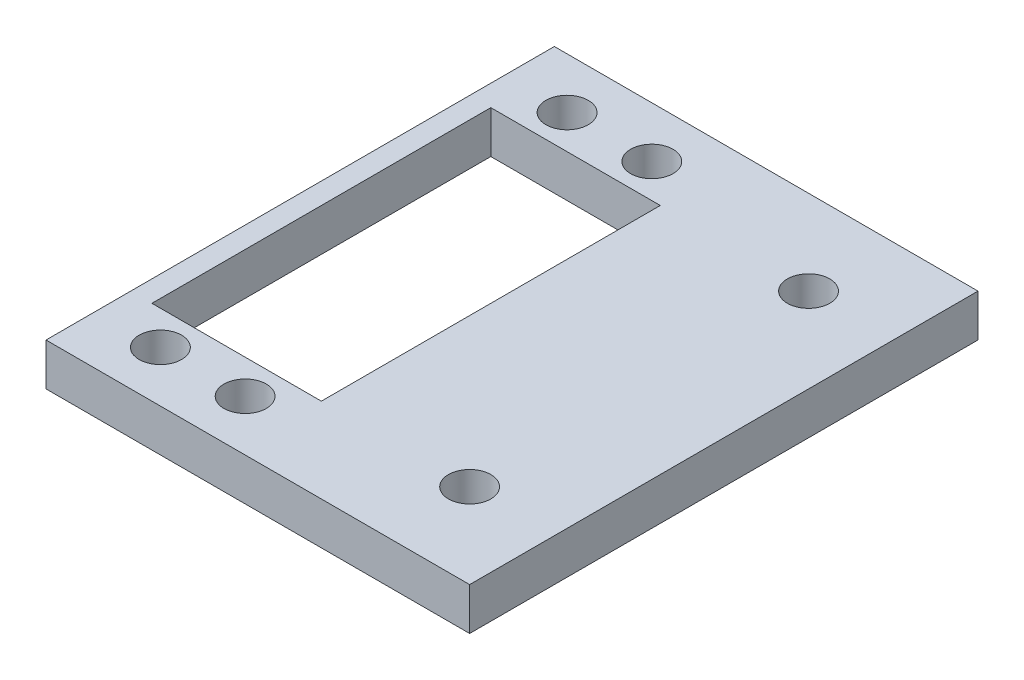
ISO-10303-21;
HEADER;
FILE_DESCRIPTION(('STEP AP214'),'2;1');
FILE_NAME('part.step','',(''),(''),'','','');
FILE_SCHEMA(('AUTOMOTIVE_DESIGN { 1 0 10303 214 1 1 1 1 }'));
ENDSEC;
DATA;
#1=APPLICATION_CONTEXT('core data for automotive mechanical design processes');
#2=APPLICATION_PROTOCOL_DEFINITION('international standard','automotive_design',2000,#1);
#3=PRODUCT_CONTEXT('',#1,'mechanical');
#4=PRODUCT('Part','Part','',(#3));
#5=PRODUCT_RELATED_PRODUCT_CATEGORY('part','',(#4));
#6=PRODUCT_DEFINITION_FORMATION('','',#4);
#7=PRODUCT_DEFINITION_CONTEXT('part definition',#1,'design');
#8=PRODUCT_DEFINITION('design','',#6,#7);
#9=PRODUCT_DEFINITION_SHAPE('','',#8);
#10=(LENGTH_UNIT() NAMED_UNIT(*) SI_UNIT(.MILLI.,.METRE.));
#11=(NAMED_UNIT(*) PLANE_ANGLE_UNIT() SI_UNIT($,.RADIAN.));
#12=(NAMED_UNIT(*) SI_UNIT($,.STERADIAN.) SOLID_ANGLE_UNIT());
#13=UNCERTAINTY_MEASURE_WITH_UNIT(LENGTH_MEASURE(1.E-05),#10,'distance_accuracy_value','');
#14=(GEOMETRIC_REPRESENTATION_CONTEXT(3) GLOBAL_UNCERTAINTY_ASSIGNED_CONTEXT((#13)) GLOBAL_UNIT_ASSIGNED_CONTEXT((#10,
#11,#12)) REPRESENTATION_CONTEXT('',''));
#15=CARTESIAN_POINT('',(0.,0.,0.));
#16=DIRECTION('',(0.,0.,1.));
#17=DIRECTION('',(1.,0.,0.));
#18=AXIS2_PLACEMENT_3D('',#15,#16,#17);
#19=CARTESIAN_POINT('',(0.,5.,0.));
#20=DIRECTION('',(0.,1.,0.));
#21=DIRECTION('',(0.,0.,1.));
#22=AXIS2_PLACEMENT_3D('',#19,#20,#21);
#23=PLANE('',#22);
#24=CARTESIAN_POINT('',(-43.1194690265487,5.,12.0088495575223));
#25=DIRECTION('',(0.,1.,0.));
#26=DIRECTION('',(0.,0.,-1.));
#27=AXIS2_PLACEMENT_3D('',#24,#25,#26);
#28=CIRCLE('',#27,2.50000000000001);
#29=CARTESIAN_POINT('',(-43.1194690265487,5.,9.50884955752231));
#30=VERTEX_POINT('',#29);
#31=EDGE_CURVE('E273',#30,#30,#28,.T.);
#32=ORIENTED_EDGE('',*,*,#31,.F.);
#33=EDGE_LOOP('',(#32));
#34=FACE_BOUND('',#33,.T.);
#35=CARTESIAN_POINT('',(-43.1194690265487,5.,-35.9911504424781));
#36=DIRECTION('',(0.,1.,0.));
#37=DIRECTION('',(0.,0.,1.));
#38=AXIS2_PLACEMENT_3D('',#35,#36,#37);
#39=CIRCLE('',#38,2.5);
#40=CARTESIAN_POINT('',(-43.1194690265487,5.,-33.4911504424781));
#41=VERTEX_POINT('',#40);
#42=EDGE_CURVE('E127',#41,#41,#39,.T.);
#43=ORIENTED_EDGE('',*,*,#42,.F.);
#44=EDGE_LOOP('',(#43));
#45=FACE_BOUND('',#44,.T.);
#46=CARTESIAN_POINT('',(-10.6194690265487,5.,-31.9911504424779));
#47=DIRECTION('',(0.,1.,0.));
#48=DIRECTION('',(0.,0.,1.));
#49=AXIS2_PLACEMENT_3D('',#46,#47,#48);
#50=CIRCLE('',#49,2.5);
#51=CARTESIAN_POINT('',(-10.6194690265487,5.,-29.4911504424779));
#52=VERTEX_POINT('',#51);
#53=EDGE_CURVE('E143',#52,#52,#50,.T.);
#54=ORIENTED_EDGE('',*,*,#53,.F.);
#55=EDGE_LOOP('',(#54));
#56=FACE_BOUND('',#55,.T.);
#57=DIRECTION('',(0.,0.,1.));
#58=VECTOR('',#57,1.);
#59=CARTESIAN_POINT('',(-50.6194690265487,5.,-41.9911504424779));
#60=LINE('',#59,#58);
#61=CARTESIAN_POINT('',(-50.6194690265487,5.,-41.9911504424779));
#62=VERTEX_POINT('',#61);
#63=CARTESIAN_POINT('',(-50.6194690265487,5.,18.0088495575221));
#64=VERTEX_POINT('',#63);
#65=EDGE_CURVE('E149',#62,#64,#60,.T.);
#66=ORIENTED_EDGE('',*,*,#65,.T.);
#67=DIRECTION('',(1.,0.,0.));
#68=VECTOR('',#67,1.);
#69=CARTESIAN_POINT('',(-50.6194690265487,5.,18.0088495575221));
#70=LINE('',#69,#68);
#71=CARTESIAN_POINT('',(-0.619469026548708,5.,18.0088495575221));
#72=VERTEX_POINT('',#71);
#73=EDGE_CURVE('E152',#64,#72,#70,.T.);
#74=ORIENTED_EDGE('',*,*,#73,.T.);
#75=DIRECTION('',(0.,0.,-1.));
#76=VECTOR('',#75,1.);
#77=CARTESIAN_POINT('',(-0.61946902654872,5.,-41.9911504424779));
#78=LINE('',#77,#76);
#79=CARTESIAN_POINT('',(-0.61946902654872,5.,-41.9911504424779));
#80=VERTEX_POINT('',#79);
#81=EDGE_CURVE('E155',#72,#80,#78,.T.);
#82=ORIENTED_EDGE('',*,*,#81,.T.);
#83=DIRECTION('',(-1.,0.,0.));
#84=VECTOR('',#83,1.);
#85=CARTESIAN_POINT('',(-50.6194690265487,5.,-41.9911504424779));
#86=LINE('',#85,#84);
#87=EDGE_CURVE('E157',#80,#62,#86,.T.);
#88=ORIENTED_EDGE('',*,*,#87,.T.);
#89=EDGE_LOOP('',(#66,#74,#82,#88));
#90=FACE_BOUND('',#89,.T.);
#91=CARTESIAN_POINT('',(-10.6194690265487,5.,8.00884955752211));
#92=DIRECTION('',(0.,1.,0.));
#93=DIRECTION('',(0.,0.,-1.));
#94=AXIS2_PLACEMENT_3D('',#91,#92,#93);
#95=CIRCLE('',#94,2.5);
#96=CARTESIAN_POINT('',(-10.6194690265487,5.,5.50884955752211));
#97=VERTEX_POINT('',#96);
#98=EDGE_CURVE('E137',#97,#97,#95,.T.);
#99=ORIENTED_EDGE('',*,*,#98,.F.);
#100=EDGE_LOOP('',(#99));
#101=FACE_BOUND('',#100,.T.);
#102=DIRECTION('',(-1.,0.,0.));
#103=VECTOR('',#102,1.);
#104=CARTESIAN_POINT('',(-48.1194690265487,5.,-31.9911504424779));
#105=LINE('',#104,#103);
#106=CARTESIAN_POINT('',(-28.1194690265487,5.,-31.9911504424779));
#107=VERTEX_POINT('',#106);
#108=CARTESIAN_POINT('',(-48.1194690265487,5.,-31.9911504424779));
#109=VERTEX_POINT('',#108);
#110=EDGE_CURVE('E106',#107,#109,#105,.T.);
#111=ORIENTED_EDGE('',*,*,#110,.F.);
#112=DIRECTION('',(0.,0.,-1.));
#113=VECTOR('',#112,1.);
#114=CARTESIAN_POINT('',(-28.1194690265487,5.,-31.9911504424779));
#115=LINE('',#114,#113);
#116=CARTESIAN_POINT('',(-28.1194690265487,5.,8.0088495575221));
#117=VERTEX_POINT('',#116);
#118=EDGE_CURVE('E98',#117,#107,#115,.T.);
#119=ORIENTED_EDGE('',*,*,#118,.F.);
#120=DIRECTION('',(1.,0.,0.));
#121=VECTOR('',#120,1.);
#122=CARTESIAN_POINT('',(-48.1194690265487,5.,8.0088495575221));
#123=LINE('',#122,#121);
#124=CARTESIAN_POINT('',(-48.1194690265487,5.,8.0088495575221));
#125=VERTEX_POINT('',#124);
#126=EDGE_CURVE('E121',#125,#117,#123,.T.);
#127=ORIENTED_EDGE('',*,*,#126,.F.);
#128=DIRECTION('',(0.,0.,1.));
#129=VECTOR('',#128,1.);
#130=CARTESIAN_POINT('',(-48.1194690265487,5.,-31.9911504424779));
#131=LINE('',#130,#129);
#132=EDGE_CURVE('E119',#109,#125,#131,.T.);
#133=ORIENTED_EDGE('',*,*,#132,.F.);
#134=EDGE_LOOP('',(#111,#119,#127,#133));
#135=FACE_BOUND('',#134,.T.);
#136=CARTESIAN_POINT('',(-33.1194690265488,5.,-35.9911504424781));
#137=DIRECTION('',(0.,1.,0.));
#138=DIRECTION('',(0.,0.,1.));
#139=AXIS2_PLACEMENT_3D('',#136,#137,#138);
#140=CIRCLE('',#139,2.49999999999999);
#141=CARTESIAN_POINT('',(-33.1194690265488,5.,-33.4911504424781));
#142=VERTEX_POINT('',#141);
#143=EDGE_CURVE('E279',#142,#142,#140,.T.);
#144=ORIENTED_EDGE('',*,*,#143,.F.);
#145=EDGE_LOOP('',(#144));
#146=FACE_BOUND('',#145,.T.);
#147=CARTESIAN_POINT('',(-33.1194690265487,5.,12.0088495575223));
#148=DIRECTION('',(0.,1.,0.));
#149=DIRECTION('',(0.,0.,-1.));
#150=AXIS2_PLACEMENT_3D('',#147,#148,#149);
#151=CIRCLE('',#150,2.49999999999999);
#152=CARTESIAN_POINT('',(-33.1194690265487,5.,9.50884955752229));
#153=VERTEX_POINT('',#152);
#154=EDGE_CURVE('E264',#153,#153,#151,.T.);
#155=ORIENTED_EDGE('',*,*,#154,.F.);
#156=EDGE_LOOP('',(#155));
#157=FACE_BOUND('',#156,.T.);
#158=ADVANCED_FACE('F33',(#34,#45,#56,#90,#101,#135,#146,#157),#23,.T.);
#159=CARTESIAN_POINT('',(0.,0.,0.));
#160=DIRECTION('',(0.,1.,0.));
#161=DIRECTION('',(0.,0.,1.));
#162=AXIS2_PLACEMENT_3D('',#159,#160,#161);
#163=PLANE('',#162);
#164=CARTESIAN_POINT('',(-10.6194690265487,0.,8.00884955752211));
#165=DIRECTION('',(0.,1.,0.));
#166=DIRECTION('',(0.,0.,-1.));
#167=AXIS2_PLACEMENT_3D('',#164,#165,#166);
#168=CIRCLE('',#167,2.5);
#169=CARTESIAN_POINT('',(-10.6194690265487,0.,5.50884955752211));
#170=VERTEX_POINT('',#169);
#171=EDGE_CURVE('E114',#170,#170,#168,.T.);
#172=ORIENTED_EDGE('',*,*,#171,.T.);
#173=EDGE_LOOP('',(#172));
#174=FACE_BOUND('',#173,.T.);
#175=CARTESIAN_POINT('',(-10.6194690265487,0.,-31.9911504424779));
#176=DIRECTION('',(0.,1.,0.));
#177=DIRECTION('',(0.,0.,1.));
#178=AXIS2_PLACEMENT_3D('',#175,#176,#177);
#179=CIRCLE('',#178,2.5);
#180=CARTESIAN_POINT('',(-10.6194690265487,0.,-29.4911504424779));
#181=VERTEX_POINT('',#180);
#182=EDGE_CURVE('E140',#181,#181,#179,.T.);
#183=ORIENTED_EDGE('',*,*,#182,.T.);
#184=EDGE_LOOP('',(#183));
#185=FACE_BOUND('',#184,.T.);
#186=DIRECTION('',(0.,0.,1.));
#187=VECTOR('',#186,1.);
#188=CARTESIAN_POINT('',(-50.6194690265487,0.,-41.9911504424779));
#189=LINE('',#188,#187);
#190=CARTESIAN_POINT('',(-50.6194690265487,0.,-41.9911504424779));
#191=VERTEX_POINT('',#190);
#192=CARTESIAN_POINT('',(-50.6194690265487,0.,18.0088495575221));
#193=VERTEX_POINT('',#192);
#194=EDGE_CURVE('E146',#191,#193,#189,.T.);
#195=ORIENTED_EDGE('',*,*,#194,.F.);
#196=DIRECTION('',(-1.,0.,0.));
#197=VECTOR('',#196,1.);
#198=CARTESIAN_POINT('',(-50.6194690265487,0.,-41.9911504424779));
#199=LINE('',#198,#197);
#200=CARTESIAN_POINT('',(-0.61946902654872,0.,-41.9911504424779));
#201=VERTEX_POINT('',#200);
#202=EDGE_CURVE('E153',#201,#191,#199,.T.);
#203=ORIENTED_EDGE('',*,*,#202,.F.);
#204=DIRECTION('',(0.,0.,-1.));
#205=VECTOR('',#204,1.);
#206=CARTESIAN_POINT('',(-0.61946902654872,0.,-41.9911504424779));
#207=LINE('',#206,#205);
#208=CARTESIAN_POINT('',(-0.619469026548708,0.,18.0088495575221));
#209=VERTEX_POINT('',#208);
#210=EDGE_CURVE('E164',#209,#201,#207,.T.);
#211=ORIENTED_EDGE('',*,*,#210,.F.);
#212=DIRECTION('',(1.,0.,0.));
#213=VECTOR('',#212,1.);
#214=CARTESIAN_POINT('',(-50.6194690265487,0.,18.0088495575221));
#215=LINE('',#214,#213);
#216=EDGE_CURVE('E162',#193,#209,#215,.T.);
#217=ORIENTED_EDGE('',*,*,#216,.F.);
#218=EDGE_LOOP('',(#195,#203,#211,#217));
#219=FACE_BOUND('',#218,.T.);
#220=DIRECTION('',(0.,0.,-1.));
#221=VECTOR('',#220,1.);
#222=CARTESIAN_POINT('',(-28.1194690265487,0.,-31.9911504424779));
#223=LINE('',#222,#221);
#224=CARTESIAN_POINT('',(-28.1194690265487,0.,8.0088495575221));
#225=VERTEX_POINT('',#224);
#226=CARTESIAN_POINT('',(-28.1194690265487,0.,-31.9911504424779));
#227=VERTEX_POINT('',#226);
#228=EDGE_CURVE('E56',#225,#227,#223,.T.);
#229=ORIENTED_EDGE('',*,*,#228,.T.);
#230=DIRECTION('',(-1.,0.,0.));
#231=VECTOR('',#230,1.);
#232=CARTESIAN_POINT('',(-48.1194690265487,0.,-31.9911504424779));
#233=LINE('',#232,#231);
#234=CARTESIAN_POINT('',(-48.1194690265487,0.,-31.9911504424779));
#235=VERTEX_POINT('',#234);
#236=EDGE_CURVE('E113',#227,#235,#233,.T.);
#237=ORIENTED_EDGE('',*,*,#236,.T.);
#238=DIRECTION('',(0.,0.,1.));
#239=VECTOR('',#238,1.);
#240=CARTESIAN_POINT('',(-48.1194690265487,0.,-31.9911504424779));
#241=LINE('',#240,#239);
#242=CARTESIAN_POINT('',(-48.1194690265487,0.,8.0088495575221));
#243=VERTEX_POINT('',#242);
#244=EDGE_CURVE('E129',#235,#243,#241,.T.);
#245=ORIENTED_EDGE('',*,*,#244,.T.);
#246=DIRECTION('',(1.,0.,0.));
#247=VECTOR('',#246,1.);
#248=CARTESIAN_POINT('',(-48.1194690265487,0.,8.0088495575221));
#249=LINE('',#248,#247);
#250=EDGE_CURVE('E107',#243,#225,#249,.T.);
#251=ORIENTED_EDGE('',*,*,#250,.T.);
#252=EDGE_LOOP('',(#229,#237,#245,#251));
#253=FACE_BOUND('',#252,.T.);
#254=CARTESIAN_POINT('',(-43.1194690265487,0.,-35.9911504424781));
#255=DIRECTION('',(0.,1.,0.));
#256=DIRECTION('',(0.,0.,1.));
#257=AXIS2_PLACEMENT_3D('',#254,#255,#256);
#258=CIRCLE('',#257,2.5);
#259=CARTESIAN_POINT('',(-43.1194690265487,0.,-33.4911504424781));
#260=VERTEX_POINT('',#259);
#261=EDGE_CURVE('E282',#260,#260,#258,.T.);
#262=ORIENTED_EDGE('',*,*,#261,.T.);
#263=EDGE_LOOP('',(#262));
#264=FACE_BOUND('',#263,.T.);
#265=CARTESIAN_POINT('',(-33.1194690265488,0.,-35.9911504424781));
#266=DIRECTION('',(0.,1.,0.));
#267=DIRECTION('',(0.,0.,1.));
#268=AXIS2_PLACEMENT_3D('',#265,#266,#267);
#269=CIRCLE('',#268,2.49999999999999);
#270=CARTESIAN_POINT('',(-33.1194690265488,0.,-33.4911504424781));
#271=VERTEX_POINT('',#270);
#272=EDGE_CURVE('E276',#271,#271,#269,.T.);
#273=ORIENTED_EDGE('',*,*,#272,.T.);
#274=EDGE_LOOP('',(#273));
#275=FACE_BOUND('',#274,.T.);
#276=CARTESIAN_POINT('',(-43.1194690265487,0.,12.0088495575223));
#277=DIRECTION('',(0.,1.,0.));
#278=DIRECTION('',(0.,0.,-1.));
#279=AXIS2_PLACEMENT_3D('',#276,#277,#278);
#280=CIRCLE('',#279,2.50000000000001);
#281=CARTESIAN_POINT('',(-43.1194690265487,0.,9.50884955752231));
#282=VERTEX_POINT('',#281);
#283=EDGE_CURVE('E270',#282,#282,#280,.T.);
#284=ORIENTED_EDGE('',*,*,#283,.T.);
#285=EDGE_LOOP('',(#284));
#286=FACE_BOUND('',#285,.T.);
#287=CARTESIAN_POINT('',(-33.1194690265487,0.,12.0088495575223));
#288=DIRECTION('',(0.,1.,0.));
#289=DIRECTION('',(0.,0.,-1.));
#290=AXIS2_PLACEMENT_3D('',#287,#288,#289);
#291=CIRCLE('',#290,2.49999999999999);
#292=CARTESIAN_POINT('',(-33.1194690265487,0.,9.50884955752229));
#293=VERTEX_POINT('',#292);
#294=EDGE_CURVE('E267',#293,#293,#291,.T.);
#295=ORIENTED_EDGE('',*,*,#294,.T.);
#296=EDGE_LOOP('',(#295));
#297=FACE_BOUND('',#296,.T.);
#298=ADVANCED_FACE('F182',(#174,#185,#219,#253,#264,#275,#286,#297),#163,.F.);
#299=CARTESIAN_POINT('',(-50.6194690265487,5.,-41.9911504424779));
#300=DIRECTION('',(1.,0.,0.));
#301=DIRECTION('',(0.,0.,-1.));
#302=AXIS2_PLACEMENT_3D('',#299,#300,#301);
#303=PLANE('',#302);
#304=ORIENTED_EDGE('',*,*,#194,.T.);
#305=DIRECTION('',(0.,-1.,0.));
#306=VECTOR('',#305,1.);
#307=CARTESIAN_POINT('',(-50.6194690265487,5.,18.0088495575221));
#308=LINE('',#307,#306);
#309=EDGE_CURVE('E11',#64,#193,#308,.T.);
#310=ORIENTED_EDGE('',*,*,#309,.F.);
#311=ORIENTED_EDGE('',*,*,#65,.F.);
#312=DIRECTION('',(0.,-1.,0.));
#313=VECTOR('',#312,1.);
#314=CARTESIAN_POINT('',(-50.6194690265487,5.,-41.9911504424779));
#315=LINE('',#314,#313);
#316=EDGE_CURVE('E159',#62,#191,#315,.T.);
#317=ORIENTED_EDGE('',*,*,#316,.T.);
#318=EDGE_LOOP('',(#304,#310,#311,#317));
#319=FACE_BOUND('',#318,.T.);
#320=ADVANCED_FACE('F35',(#319),#303,.F.);
#321=CARTESIAN_POINT('',(-50.6194690265487,5.,18.0088495575221));
#322=DIRECTION('',(0.,0.,-1.));
#323=DIRECTION('',(-1.,0.,0.));
#324=AXIS2_PLACEMENT_3D('',#321,#322,#323);
#325=PLANE('',#324);
#326=ORIENTED_EDGE('',*,*,#216,.T.);
#327=DIRECTION('',(0.,-1.,0.));
#328=VECTOR('',#327,1.);
#329=CARTESIAN_POINT('',(-0.619469026548708,5.,18.0088495575221));
#330=LINE('',#329,#328);
#331=EDGE_CURVE('E41',#72,#209,#330,.T.);
#332=ORIENTED_EDGE('',*,*,#331,.F.);
#333=ORIENTED_EDGE('',*,*,#73,.F.);
#334=ORIENTED_EDGE('',*,*,#309,.T.);
#335=EDGE_LOOP('',(#326,#332,#333,#334));
#336=FACE_BOUND('',#335,.T.);
#337=ADVANCED_FACE('F193',(#336),#325,.F.);
#338=CARTESIAN_POINT('',(-0.61946902654872,5.,-41.9911504424779));
#339=DIRECTION('',(-1.,0.,0.));
#340=DIRECTION('',(0.,0.,1.));
#341=AXIS2_PLACEMENT_3D('',#338,#339,#340);
#342=PLANE('',#341);
#343=ORIENTED_EDGE('',*,*,#210,.T.);
#344=DIRECTION('',(0.,-1.,0.));
#345=VECTOR('',#344,1.);
#346=CARTESIAN_POINT('',(-0.61946902654872,5.,-41.9911504424779));
#347=LINE('',#346,#345);
#348=EDGE_CURVE('E169',#80,#201,#347,.T.);
#349=ORIENTED_EDGE('',*,*,#348,.F.);
#350=ORIENTED_EDGE('',*,*,#81,.F.);
#351=ORIENTED_EDGE('',*,*,#331,.T.);
#352=EDGE_LOOP('',(#343,#349,#350,#351));
#353=FACE_BOUND('',#352,.T.);
#354=ADVANCED_FACE('F176',(#353),#342,.F.);
#355=CARTESIAN_POINT('',(-50.6194690265487,5.,-41.9911504424779));
#356=DIRECTION('',(0.,0.,1.));
#357=DIRECTION('',(1.,0.,0.));
#358=AXIS2_PLACEMENT_3D('',#355,#356,#357);
#359=PLANE('',#358);
#360=ORIENTED_EDGE('',*,*,#202,.T.);
#361=ORIENTED_EDGE('',*,*,#316,.F.);
#362=ORIENTED_EDGE('',*,*,#87,.F.);
#363=ORIENTED_EDGE('',*,*,#348,.T.);
#364=EDGE_LOOP('',(#360,#361,#362,#363));
#365=FACE_BOUND('',#364,.T.);
#366=ADVANCED_FACE('F186',(#365),#359,.F.);
#367=CARTESIAN_POINT('',(-10.6194690265487,5.,-31.9911504424779));
#368=DIRECTION('',(0.,-1.,0.));
#369=DIRECTION('',(0.,0.,-1.));
#370=AXIS2_PLACEMENT_3D('',#367,#368,#369);
#371=CYLINDRICAL_SURFACE('',#370,2.5);
#372=ORIENTED_EDGE('',*,*,#53,.T.);
#373=EDGE_LOOP('',(#372));
#374=FACE_BOUND('',#373,.T.);
#375=ORIENTED_EDGE('',*,*,#182,.F.);
#376=EDGE_LOOP('',(#375));
#377=FACE_BOUND('',#376,.T.);
#378=ADVANCED_FACE('F211',(#374,#377),#371,.F.);
#379=CARTESIAN_POINT('',(-10.6194690265487,5.,8.00884955752211));
#380=DIRECTION('',(0.,-1.,0.));
#381=DIRECTION('',(0.,0.,-1.));
#382=AXIS2_PLACEMENT_3D('',#379,#380,#381);
#383=CYLINDRICAL_SURFACE('',#382,2.5);
#384=ORIENTED_EDGE('',*,*,#98,.T.);
#385=EDGE_LOOP('',(#384));
#386=FACE_BOUND('',#385,.T.);
#387=ORIENTED_EDGE('',*,*,#171,.F.);
#388=EDGE_LOOP('',(#387));
#389=FACE_BOUND('',#388,.T.);
#390=ADVANCED_FACE('F218',(#386,#389),#383,.F.);
#391=CARTESIAN_POINT('',(-28.1194690265487,5.,-31.9911504424779));
#392=DIRECTION('',(-1.,0.,0.));
#393=DIRECTION('',(0.,0.,1.));
#394=AXIS2_PLACEMENT_3D('',#391,#392,#393);
#395=PLANE('',#394);
#396=ORIENTED_EDGE('',*,*,#228,.F.);
#397=DIRECTION('',(0.,-1.,0.));
#398=VECTOR('',#397,1.);
#399=CARTESIAN_POINT('',(-28.1194690265487,5.,8.0088495575221));
#400=LINE('',#399,#398);
#401=EDGE_CURVE('E102',#117,#225,#400,.T.);
#402=ORIENTED_EDGE('',*,*,#401,.F.);
#403=ORIENTED_EDGE('',*,*,#118,.T.);
#404=DIRECTION('',(0.,-1.,0.));
#405=VECTOR('',#404,1.);
#406=CARTESIAN_POINT('',(-28.1194690265487,5.,-31.9911504424779));
#407=LINE('',#406,#405);
#408=EDGE_CURVE('E101',#107,#227,#407,.T.);
#409=ORIENTED_EDGE('',*,*,#408,.T.);
#410=EDGE_LOOP('',(#396,#402,#403,#409));
#411=FACE_BOUND('',#410,.T.);
#412=ADVANCED_FACE('F100',(#411),#395,.T.);
#413=CARTESIAN_POINT('',(-48.1194690265487,5.,-31.9911504424779));
#414=DIRECTION('',(0.,0.,1.));
#415=DIRECTION('',(1.,0.,0.));
#416=AXIS2_PLACEMENT_3D('',#413,#414,#415);
#417=PLANE('',#416);
#418=ORIENTED_EDGE('',*,*,#236,.F.);
#419=ORIENTED_EDGE('',*,*,#408,.F.);
#420=ORIENTED_EDGE('',*,*,#110,.T.);
#421=DIRECTION('',(0.,-1.,0.));
#422=VECTOR('',#421,1.);
#423=CARTESIAN_POINT('',(-48.1194690265487,5.,-31.9911504424779));
#424=LINE('',#423,#422);
#425=EDGE_CURVE('E115',#109,#235,#424,.T.);
#426=ORIENTED_EDGE('',*,*,#425,.T.);
#427=EDGE_LOOP('',(#418,#419,#420,#426));
#428=FACE_BOUND('',#427,.T.);
#429=ADVANCED_FACE('F110',(#428),#417,.T.);
#430=CARTESIAN_POINT('',(-48.1194690265487,5.,-31.9911504424779));
#431=DIRECTION('',(1.,0.,0.));
#432=DIRECTION('',(0.,0.,-1.));
#433=AXIS2_PLACEMENT_3D('',#430,#431,#432);
#434=PLANE('',#433);
#435=ORIENTED_EDGE('',*,*,#244,.F.);
#436=ORIENTED_EDGE('',*,*,#425,.F.);
#437=ORIENTED_EDGE('',*,*,#132,.T.);
#438=DIRECTION('',(0.,-1.,0.));
#439=VECTOR('',#438,1.);
#440=CARTESIAN_POINT('',(-48.1194690265487,5.,8.0088495575221));
#441=LINE('',#440,#439);
#442=EDGE_CURVE('E48',#125,#243,#441,.T.);
#443=ORIENTED_EDGE('',*,*,#442,.T.);
#444=EDGE_LOOP('',(#435,#436,#437,#443));
#445=FACE_BOUND('',#444,.T.);
#446=ADVANCED_FACE('F237',(#445),#434,.T.);
#447=CARTESIAN_POINT('',(-48.1194690265487,5.,8.0088495575221));
#448=DIRECTION('',(0.,0.,-1.));
#449=DIRECTION('',(-1.,0.,0.));
#450=AXIS2_PLACEMENT_3D('',#447,#448,#449);
#451=PLANE('',#450);
#452=ORIENTED_EDGE('',*,*,#250,.F.);
#453=ORIENTED_EDGE('',*,*,#442,.F.);
#454=ORIENTED_EDGE('',*,*,#126,.T.);
#455=ORIENTED_EDGE('',*,*,#401,.T.);
#456=EDGE_LOOP('',(#452,#453,#454,#455));
#457=FACE_BOUND('',#456,.T.);
#458=ADVANCED_FACE('F240',(#457),#451,.T.);
#459=CARTESIAN_POINT('',(-43.1194690265487,5.,-35.9911504424781));
#460=DIRECTION('',(0.,-1.,0.));
#461=DIRECTION('',(0.,0.,-1.));
#462=AXIS2_PLACEMENT_3D('',#459,#460,#461);
#463=CYLINDRICAL_SURFACE('',#462,2.5);
#464=ORIENTED_EDGE('',*,*,#42,.T.);
#465=EDGE_LOOP('',(#464));
#466=FACE_BOUND('',#465,.T.);
#467=ORIENTED_EDGE('',*,*,#261,.F.);
#468=EDGE_LOOP('',(#467));
#469=FACE_BOUND('',#468,.T.);
#470=ADVANCED_FACE('F244',(#466,#469),#463,.F.);
#471=CARTESIAN_POINT('',(-33.1194690265488,5.,-35.9911504424781));
#472=DIRECTION('',(0.,-1.,0.));
#473=DIRECTION('',(0.,0.,-1.));
#474=AXIS2_PLACEMENT_3D('',#471,#472,#473);
#475=CYLINDRICAL_SURFACE('',#474,2.49999999999999);
#476=ORIENTED_EDGE('',*,*,#143,.T.);
#477=EDGE_LOOP('',(#476));
#478=FACE_BOUND('',#477,.T.);
#479=ORIENTED_EDGE('',*,*,#272,.F.);
#480=EDGE_LOOP('',(#479));
#481=FACE_BOUND('',#480,.T.);
#482=ADVANCED_FACE('F247',(#478,#481),#475,.F.);
#483=CARTESIAN_POINT('',(-43.1194690265487,5.,12.0088495575223));
#484=DIRECTION('',(0.,-1.,0.));
#485=DIRECTION('',(0.,0.,-1.));
#486=AXIS2_PLACEMENT_3D('',#483,#484,#485);
#487=CYLINDRICAL_SURFACE('',#486,2.50000000000001);
#488=ORIENTED_EDGE('',*,*,#31,.T.);
#489=EDGE_LOOP('',(#488));
#490=FACE_BOUND('',#489,.T.);
#491=ORIENTED_EDGE('',*,*,#283,.F.);
#492=EDGE_LOOP('',(#491));
#493=FACE_BOUND('',#492,.T.);
#494=ADVANCED_FACE('F251',(#490,#493),#487,.F.);
#495=CARTESIAN_POINT('',(-33.1194690265487,5.,12.0088495575223));
#496=DIRECTION('',(0.,-1.,0.));
#497=DIRECTION('',(0.,0.,-1.));
#498=AXIS2_PLACEMENT_3D('',#495,#496,#497);
#499=CYLINDRICAL_SURFACE('',#498,2.49999999999999);
#500=ORIENTED_EDGE('',*,*,#154,.T.);
#501=EDGE_LOOP('',(#500));
#502=FACE_BOUND('',#501,.T.);
#503=ORIENTED_EDGE('',*,*,#294,.F.);
#504=EDGE_LOOP('',(#503));
#505=FACE_BOUND('',#504,.T.);
#506=ADVANCED_FACE('F255',(#502,#505),#499,.F.);
#507=CLOSED_SHELL('',(#158,#298,#320,#337,#354,#366,#378,#390,#412,#429,#446,#458,#470,#482,
#494,#506));
#508=MANIFOLD_SOLID_BREP('B2',#507);
#509=ADVANCED_BREP_SHAPE_REPRESENTATION('',(#18,#508),#14);
#510=SHAPE_DEFINITION_REPRESENTATION(#9,#509);
ENDSEC;
END-ISO-10303-21;
